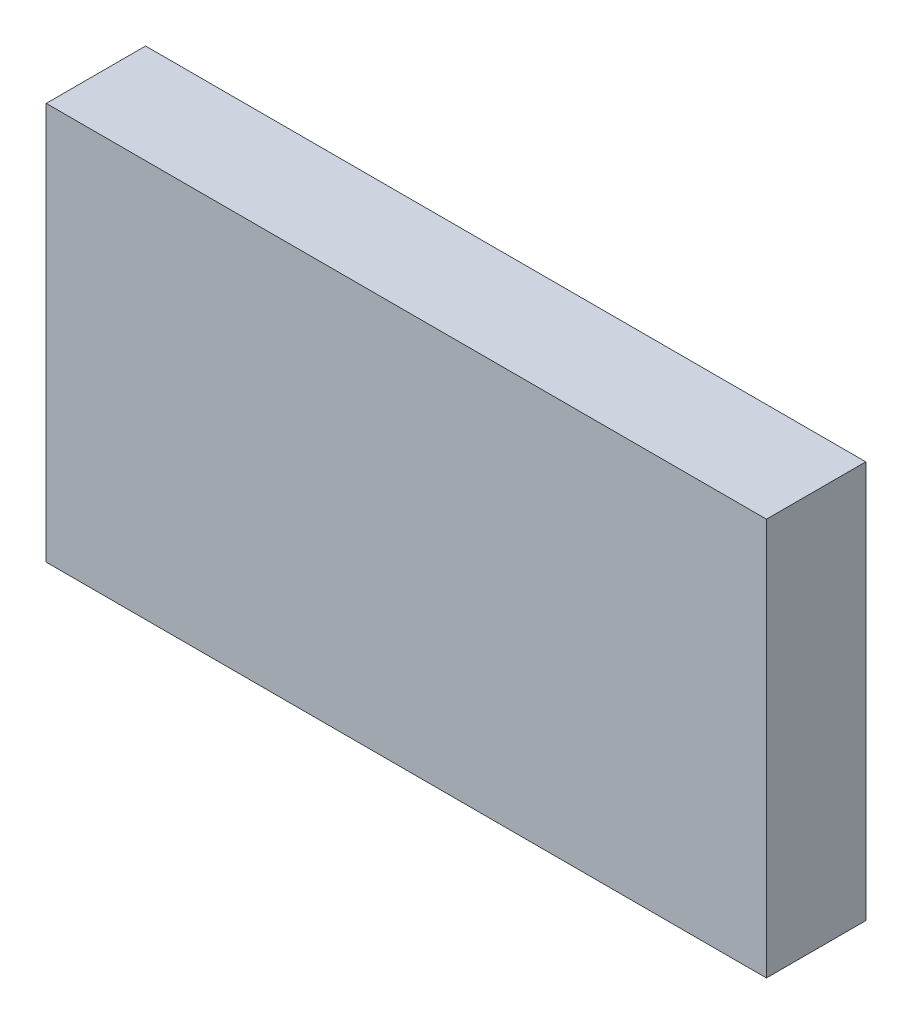
ISO-10303-21;
HEADER;
FILE_DESCRIPTION(('STEP AP214'),'2;1');
FILE_NAME('part.step','',(''),(''),'','','');
FILE_SCHEMA(('AUTOMOTIVE_DESIGN { 1 0 10303 214 1 1 1 1 }'));
ENDSEC;
DATA;
#1=APPLICATION_CONTEXT('core data for automotive mechanical design processes');
#2=APPLICATION_PROTOCOL_DEFINITION('international standard','automotive_design',2000,#1);
#3=PRODUCT_CONTEXT('',#1,'mechanical');
#4=PRODUCT('Part','Part','',(#3));
#5=PRODUCT_RELATED_PRODUCT_CATEGORY('part','',(#4));
#6=PRODUCT_DEFINITION_FORMATION('','',#4);
#7=PRODUCT_DEFINITION_CONTEXT('part definition',#1,'design');
#8=PRODUCT_DEFINITION('design','',#6,#7);
#9=PRODUCT_DEFINITION_SHAPE('','',#8);
#10=(LENGTH_UNIT() NAMED_UNIT(*) SI_UNIT(.MILLI.,.METRE.));
#11=(NAMED_UNIT(*) PLANE_ANGLE_UNIT() SI_UNIT($,.RADIAN.));
#12=(NAMED_UNIT(*) SI_UNIT($,.STERADIAN.) SOLID_ANGLE_UNIT());
#13=UNCERTAINTY_MEASURE_WITH_UNIT(LENGTH_MEASURE(1.E-05),#10,'distance_accuracy_value','');
#14=(GEOMETRIC_REPRESENTATION_CONTEXT(3) GLOBAL_UNCERTAINTY_ASSIGNED_CONTEXT((#13)) GLOBAL_UNIT_ASSIGNED_CONTEXT((#10,
#11,#12)) REPRESENTATION_CONTEXT('',''));
#15=CARTESIAN_POINT('',(0.,0.,0.));
#16=DIRECTION('',(0.,0.,1.));
#17=DIRECTION('',(1.,0.,0.));
#18=AXIS2_PLACEMENT_3D('',#15,#16,#17);
#19=CARTESIAN_POINT('',(72.5,-40.,20.));
#20=DIRECTION('',(-1.,0.,0.));
#21=DIRECTION('',(0.,0.,1.));
#22=AXIS2_PLACEMENT_3D('',#19,#20,#21);
#23=PLANE('',#22);
#24=DIRECTION('',(0.,1.,0.));
#25=VECTOR('',#24,1.);
#26=CARTESIAN_POINT('',(72.5,-40.,0.));
#27=LINE('',#26,#25);
#28=CARTESIAN_POINT('',(72.5,-40.,0.));
#29=VERTEX_POINT('',#28);
#30=CARTESIAN_POINT('',(72.5,40.,0.));
#31=VERTEX_POINT('',#30);
#32=EDGE_CURVE('E113',#29,#31,#27,.T.);
#33=ORIENTED_EDGE('',*,*,#32,.T.);
#34=DIRECTION('',(0.,0.,-1.));
#35=VECTOR('',#34,1.);
#36=CARTESIAN_POINT('',(72.5,40.,20.));
#37=LINE('',#36,#35);
#38=CARTESIAN_POINT('',(72.5,40.,20.));
#39=VERTEX_POINT('',#38);
#40=EDGE_CURVE('E11',#39,#31,#37,.T.);
#41=ORIENTED_EDGE('',*,*,#40,.F.);
#42=DIRECTION('',(0.,1.,0.));
#43=VECTOR('',#42,1.);
#44=CARTESIAN_POINT('',(72.5,-40.,20.));
#45=LINE('',#44,#43);
#46=CARTESIAN_POINT('',(72.5,-40.,20.));
#47=VERTEX_POINT('',#46);
#48=EDGE_CURVE('E97',#47,#39,#45,.T.);
#49=ORIENTED_EDGE('',*,*,#48,.F.);
#50=DIRECTION('',(0.,0.,-1.));
#51=VECTOR('',#50,1.);
#52=CARTESIAN_POINT('',(72.5,-40.,20.));
#53=LINE('',#52,#51);
#54=EDGE_CURVE('E109',#47,#29,#53,.T.);
#55=ORIENTED_EDGE('',*,*,#54,.T.);
#56=EDGE_LOOP('',(#33,#41,#49,#55));
#57=FACE_BOUND('',#56,.T.);
#58=ADVANCED_FACE('F45',(#57),#23,.F.);
#59=CARTESIAN_POINT('',(-72.5,40.,20.));
#60=DIRECTION('',(0.,-1.,0.));
#61=DIRECTION('',(0.,0.,-1.));
#62=AXIS2_PLACEMENT_3D('',#59,#60,#61);
#63=PLANE('',#62);
#64=DIRECTION('',(-1.,0.,0.));
#65=VECTOR('',#64,1.);
#66=CARTESIAN_POINT('',(-72.5,40.,0.));
#67=LINE('',#66,#65);
#68=CARTESIAN_POINT('',(-72.5,40.,0.));
#69=VERTEX_POINT('',#68);
#70=EDGE_CURVE('E102',#31,#69,#67,.T.);
#71=ORIENTED_EDGE('',*,*,#70,.T.);
#72=DIRECTION('',(0.,0.,-1.));
#73=VECTOR('',#72,1.);
#74=CARTESIAN_POINT('',(-72.5,40.,20.));
#75=LINE('',#74,#73);
#76=CARTESIAN_POINT('',(-72.5,40.,20.));
#77=VERTEX_POINT('',#76);
#78=EDGE_CURVE('E54',#77,#69,#75,.T.);
#79=ORIENTED_EDGE('',*,*,#78,.F.);
#80=DIRECTION('',(-1.,0.,0.));
#81=VECTOR('',#80,1.);
#82=CARTESIAN_POINT('',(-72.5,40.,20.));
#83=LINE('',#82,#81);
#84=EDGE_CURVE('E92',#39,#77,#83,.T.);
#85=ORIENTED_EDGE('',*,*,#84,.F.);
#86=ORIENTED_EDGE('',*,*,#40,.T.);
#87=EDGE_LOOP('',(#71,#79,#85,#86));
#88=FACE_BOUND('',#87,.T.);
#89=ADVANCED_FACE('F101',(#88),#63,.F.);
#90=CARTESIAN_POINT('',(-72.5,-40.,20.));
#91=DIRECTION('',(1.,0.,0.));
#92=DIRECTION('',(0.,0.,-1.));
#93=AXIS2_PLACEMENT_3D('',#90,#91,#92);
#94=PLANE('',#93);
#95=DIRECTION('',(0.,-1.,0.));
#96=VECTOR('',#95,1.);
#97=CARTESIAN_POINT('',(-72.5,-40.,0.));
#98=LINE('',#97,#96);
#99=CARTESIAN_POINT('',(-72.5,-40.,0.));
#100=VERTEX_POINT('',#99);
#101=EDGE_CURVE('E79',#69,#100,#98,.T.);
#102=ORIENTED_EDGE('',*,*,#101,.T.);
#103=DIRECTION('',(0.,0.,-1.));
#104=VECTOR('',#103,1.);
#105=CARTESIAN_POINT('',(-72.5,-40.,20.));
#106=LINE('',#105,#104);
#107=CARTESIAN_POINT('',(-72.5,-40.,20.));
#108=VERTEX_POINT('',#107);
#109=EDGE_CURVE('E104',#108,#100,#106,.T.);
#110=ORIENTED_EDGE('',*,*,#109,.F.);
#111=DIRECTION('',(0.,-1.,0.));
#112=VECTOR('',#111,1.);
#113=CARTESIAN_POINT('',(-72.5,-40.,20.));
#114=LINE('',#113,#112);
#115=EDGE_CURVE('E95',#77,#108,#114,.T.);
#116=ORIENTED_EDGE('',*,*,#115,.F.);
#117=ORIENTED_EDGE('',*,*,#78,.T.);
#118=EDGE_LOOP('',(#102,#110,#116,#117));
#119=FACE_BOUND('',#118,.T.);
#120=ADVANCED_FACE('F105',(#119),#94,.F.);
#121=CARTESIAN_POINT('',(-72.5,-40.,20.));
#122=DIRECTION('',(0.,1.,0.));
#123=DIRECTION('',(0.,0.,1.));
#124=AXIS2_PLACEMENT_3D('',#121,#122,#123);
#125=PLANE('',#124);
#126=DIRECTION('',(1.,0.,0.));
#127=VECTOR('',#126,1.);
#128=CARTESIAN_POINT('',(-72.5,-40.,0.));
#129=LINE('',#128,#127);
#130=EDGE_CURVE('E85',#100,#29,#129,.T.);
#131=ORIENTED_EDGE('',*,*,#130,.T.);
#132=ORIENTED_EDGE('',*,*,#54,.F.);
#133=DIRECTION('',(1.,0.,0.));
#134=VECTOR('',#133,1.);
#135=CARTESIAN_POINT('',(-72.5,-40.,20.));
#136=LINE('',#135,#134);
#137=EDGE_CURVE('E62',#108,#47,#136,.T.);
#138=ORIENTED_EDGE('',*,*,#137,.F.);
#139=ORIENTED_EDGE('',*,*,#109,.T.);
#140=EDGE_LOOP('',(#131,#132,#138,#139));
#141=FACE_BOUND('',#140,.T.);
#142=ADVANCED_FACE('F126',(#141),#125,.F.);
#143=CARTESIAN_POINT('',(0.,0.,20.));
#144=DIRECTION('',(0.,0.,-1.));
#145=DIRECTION('',(-1.,0.,0.));
#146=AXIS2_PLACEMENT_3D('',#143,#144,#145);
#147=PLANE('',#146);
#148=ORIENTED_EDGE('',*,*,#48,.T.);
#149=ORIENTED_EDGE('',*,*,#84,.T.);
#150=ORIENTED_EDGE('',*,*,#115,.T.);
#151=ORIENTED_EDGE('',*,*,#137,.T.);
#152=EDGE_LOOP('',(#148,#149,#150,#151));
#153=FACE_BOUND('',#152,.T.);
#154=ADVANCED_FACE('F93',(#153),#147,.F.);
#155=CARTESIAN_POINT('',(0.,0.,0.));
#156=DIRECTION('',(0.,0.,-1.));
#157=DIRECTION('',(-1.,0.,0.));
#158=AXIS2_PLACEMENT_3D('',#155,#156,#157);
#159=PLANE('',#158);
#160=ORIENTED_EDGE('',*,*,#32,.F.);
#161=ORIENTED_EDGE('',*,*,#130,.F.);
#162=ORIENTED_EDGE('',*,*,#101,.F.);
#163=ORIENTED_EDGE('',*,*,#70,.F.);
#164=EDGE_LOOP('',(#160,#161,#162,#163));
#165=FACE_BOUND('',#164,.T.);
#166=ADVANCED_FACE('F129',(#165),#159,.T.);
#167=CLOSED_SHELL('',(#58,#89,#120,#142,#154,#166));
#168=MANIFOLD_SOLID_BREP('B2',#167);
#169=ADVANCED_BREP_SHAPE_REPRESENTATION('',(#18,#168),#14);
#170=SHAPE_DEFINITION_REPRESENTATION(#9,#169);
ENDSEC;
END-ISO-10303-21;
